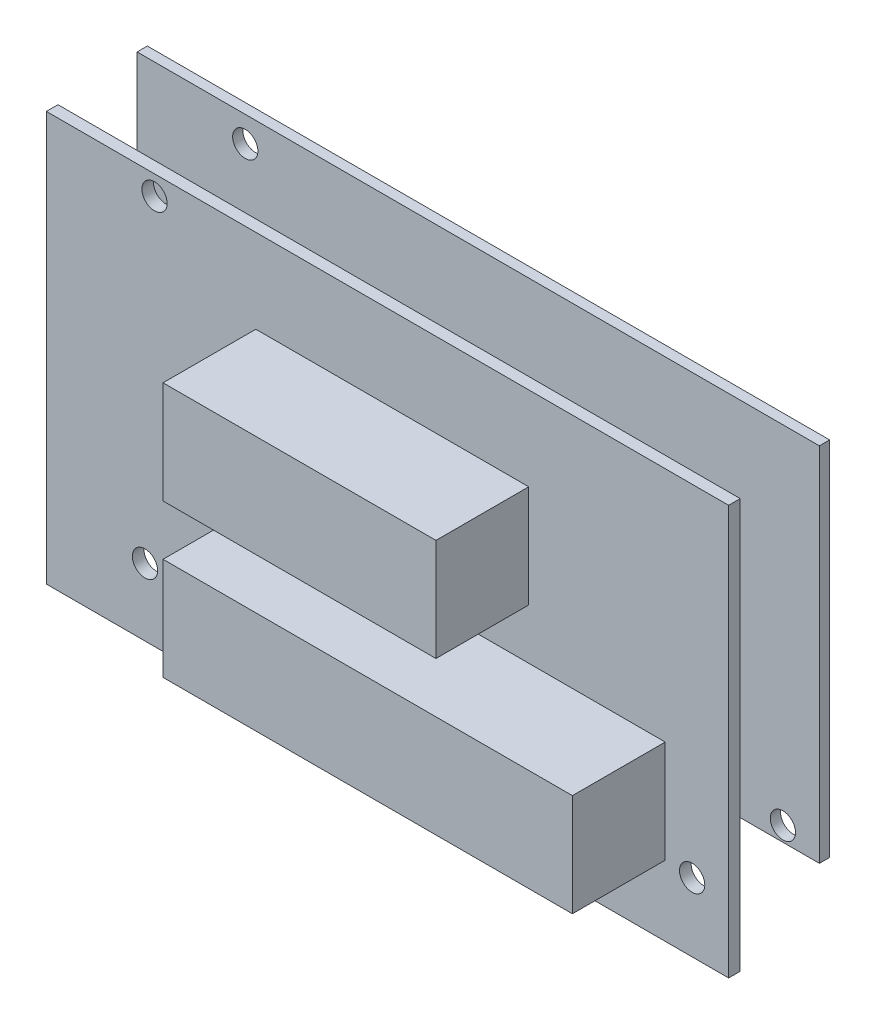
ISO-10303-21;
HEADER;
FILE_DESCRIPTION(('STEP AP214'),'2;1');
FILE_NAME('part.step','',(''),(''),'','','');
FILE_SCHEMA(('AUTOMOTIVE_DESIGN { 1 0 10303 214 1 1 1 1 }'));
ENDSEC;
DATA;
#1=APPLICATION_CONTEXT('core data for automotive mechanical design processes');
#2=APPLICATION_PROTOCOL_DEFINITION('international standard','automotive_design',2000,#1);
#3=PRODUCT_CONTEXT('',#1,'mechanical');
#4=PRODUCT('Part','Part','',(#3));
#5=PRODUCT_RELATED_PRODUCT_CATEGORY('part','',(#4));
#6=PRODUCT_DEFINITION_FORMATION('','',#4);
#7=PRODUCT_DEFINITION_CONTEXT('part definition',#1,'design');
#8=PRODUCT_DEFINITION('design','',#6,#7);
#9=PRODUCT_DEFINITION_SHAPE('','',#8);
#10=(LENGTH_UNIT() NAMED_UNIT(*) SI_UNIT(.MILLI.,.METRE.));
#11=(NAMED_UNIT(*) PLANE_ANGLE_UNIT() SI_UNIT($,.RADIAN.));
#12=(NAMED_UNIT(*) SI_UNIT($,.STERADIAN.) SOLID_ANGLE_UNIT());
#13=UNCERTAINTY_MEASURE_WITH_UNIT(LENGTH_MEASURE(1.E-05),#10,'distance_accuracy_value','');
#14=(GEOMETRIC_REPRESENTATION_CONTEXT(3) GLOBAL_UNCERTAINTY_ASSIGNED_CONTEXT((#13)) GLOBAL_UNIT_ASSIGNED_CONTEXT((#10,
#11,#12)) REPRESENTATION_CONTEXT('',''));
#15=CARTESIAN_POINT('',(0.,0.,0.));
#16=DIRECTION('',(0.,0.,1.));
#17=DIRECTION('',(1.,0.,0.));
#18=AXIS2_PLACEMENT_3D('',#15,#16,#17);
#19=CARTESIAN_POINT('',(0.,0.,-13.1));
#20=DIRECTION('',(0.,0.,1.));
#21=DIRECTION('',(1.,0.,0.));
#22=AXIS2_PLACEMENT_3D('',#19,#20,#21);
#23=PLANE('',#22);
#24=DIRECTION('',(0.,1.,0.));
#25=VECTOR('',#24,1.);
#26=CARTESIAN_POINT('',(-50.,30.9,-13.1));
#27=LINE('',#26,#25);
#28=CARTESIAN_POINT('',(-50.,-22.1,-13.1));
#29=VERTEX_POINT('',#28);
#30=CARTESIAN_POINT('',(-50.,30.9,-13.1));
#31=VERTEX_POINT('',#30);
#32=EDGE_CURVE('E95',#29,#31,#27,.T.);
#33=ORIENTED_EDGE('',*,*,#32,.T.);
#34=DIRECTION('',(1.,0.,0.));
#35=VECTOR('',#34,1.);
#36=CARTESIAN_POINT('',(-50.,30.9,-13.1));
#37=LINE('',#36,#35);
#38=CARTESIAN_POINT('',(50.,30.9,-13.1));
#39=VERTEX_POINT('',#38);
#40=EDGE_CURVE('E90',#31,#39,#37,.T.);
#41=ORIENTED_EDGE('',*,*,#40,.T.);
#42=DIRECTION('',(0.,-1.,0.));
#43=VECTOR('',#42,1.);
#44=CARTESIAN_POINT('',(50.,30.9,-13.1));
#45=LINE('',#44,#43);
#46=CARTESIAN_POINT('',(50.,-22.1,-13.1));
#47=VERTEX_POINT('',#46);
#48=EDGE_CURVE('E93',#39,#47,#45,.T.);
#49=ORIENTED_EDGE('',*,*,#48,.T.);
#50=DIRECTION('',(-1.,0.,0.));
#51=VECTOR('',#50,1.);
#52=CARTESIAN_POINT('',(-50.,-22.1,-13.1));
#53=LINE('',#52,#51);
#54=EDGE_CURVE('E60',#47,#29,#53,.T.);
#55=ORIENTED_EDGE('',*,*,#54,.T.);
#56=EDGE_LOOP('',(#33,#41,#49,#55));
#57=FACE_BOUND('',#56,.T.);
#58=CARTESIAN_POINT('',(44.65,-19.95,-13.1));
#59=DIRECTION('',(0.,0.,-1.));
#60=DIRECTION('',(-1.,0.,0.));
#61=AXIS2_PLACEMENT_3D('',#58,#59,#60);
#62=CIRCLE('',#61,1.85);
#63=CARTESIAN_POINT('',(42.8,-19.95,-13.1));
#64=VERTEX_POINT('',#63);
#65=EDGE_CURVE('E110',#64,#64,#62,.T.);
#66=ORIENTED_EDGE('',*,*,#65,.F.);
#67=EDGE_LOOP('',(#66));
#68=FACE_BOUND('',#67,.T.);
#69=CARTESIAN_POINT('',(-34.15,27.15,-13.1));
#70=DIRECTION('',(0.,0.,-1.));
#71=DIRECTION('',(-1.,0.,0.));
#72=AXIS2_PLACEMENT_3D('',#69,#70,#71);
#73=CIRCLE('',#72,1.85);
#74=CARTESIAN_POINT('',(-36.,27.15,-13.1));
#75=VERTEX_POINT('',#74);
#76=EDGE_CURVE('E125',#75,#75,#73,.T.);
#77=ORIENTED_EDGE('',*,*,#76,.F.);
#78=EDGE_LOOP('',(#77));
#79=FACE_BOUND('',#78,.T.);
#80=CARTESIAN_POINT('',(-35.55,-20.15,-13.1));
#81=DIRECTION('',(0.,0.,-1.));
#82=DIRECTION('',(-1.,0.,0.));
#83=AXIS2_PLACEMENT_3D('',#80,#81,#82);
#84=CIRCLE('',#83,1.85);
#85=CARTESIAN_POINT('',(-37.4,-20.15,-13.1));
#86=VERTEX_POINT('',#85);
#87=EDGE_CURVE('E131',#86,#86,#84,.T.);
#88=ORIENTED_EDGE('',*,*,#87,.F.);
#89=EDGE_LOOP('',(#88));
#90=FACE_BOUND('',#89,.T.);
#91=ADVANCED_FACE('F43',(#57,#68,#79,#90),#23,.F.);
#92=CARTESIAN_POINT('',(0.,0.,-11.6));
#93=DIRECTION('',(0.,0.,1.));
#94=DIRECTION('',(1.,0.,0.));
#95=AXIS2_PLACEMENT_3D('',#92,#93,#94);
#96=PLANE('',#95);
#97=CARTESIAN_POINT('',(-34.15,27.15,-11.6));
#98=DIRECTION('',(0.,0.,-1.));
#99=DIRECTION('',(-1.,0.,0.));
#100=AXIS2_PLACEMENT_3D('',#97,#98,#99);
#101=CIRCLE('',#100,1.85);
#102=CARTESIAN_POINT('',(-36.,27.15,-11.6));
#103=VERTEX_POINT('',#102);
#104=EDGE_CURVE('E128',#103,#103,#101,.T.);
#105=ORIENTED_EDGE('',*,*,#104,.T.);
#106=EDGE_LOOP('',(#105));
#107=FACE_BOUND('',#106,.T.);
#108=DIRECTION('',(0.,1.,0.));
#109=VECTOR('',#108,1.);
#110=CARTESIAN_POINT('',(-50.,30.9,-11.6));
#111=LINE('',#110,#109);
#112=CARTESIAN_POINT('',(-50.,-22.1,-11.6));
#113=VERTEX_POINT('',#112);
#114=CARTESIAN_POINT('',(-50.,30.9,-11.6));
#115=VERTEX_POINT('',#114);
#116=EDGE_CURVE('E107',#113,#115,#111,.T.);
#117=ORIENTED_EDGE('',*,*,#116,.F.);
#118=DIRECTION('',(-1.,0.,0.));
#119=VECTOR('',#118,1.);
#120=CARTESIAN_POINT('',(-50.,-22.1,-11.6));
#121=LINE('',#120,#119);
#122=CARTESIAN_POINT('',(50.,-22.1,-11.6));
#123=VERTEX_POINT('',#122);
#124=EDGE_CURVE('E83',#123,#113,#121,.T.);
#125=ORIENTED_EDGE('',*,*,#124,.F.);
#126=DIRECTION('',(0.,-1.,0.));
#127=VECTOR('',#126,1.);
#128=CARTESIAN_POINT('',(50.,30.9,-11.6));
#129=LINE('',#128,#127);
#130=CARTESIAN_POINT('',(50.,30.9,-11.6));
#131=VERTEX_POINT('',#130);
#132=EDGE_CURVE('E77',#131,#123,#129,.T.);
#133=ORIENTED_EDGE('',*,*,#132,.F.);
#134=DIRECTION('',(1.,0.,0.));
#135=VECTOR('',#134,1.);
#136=CARTESIAN_POINT('',(-50.,30.9,-11.6));
#137=LINE('',#136,#135);
#138=EDGE_CURVE('E99',#115,#131,#137,.T.);
#139=ORIENTED_EDGE('',*,*,#138,.F.);
#140=EDGE_LOOP('',(#117,#125,#133,#139));
#141=FACE_BOUND('',#140,.T.);
#142=CARTESIAN_POINT('',(44.65,-19.95,-11.6));
#143=DIRECTION('',(0.,0.,-1.));
#144=DIRECTION('',(-1.,0.,0.));
#145=AXIS2_PLACEMENT_3D('',#142,#143,#144);
#146=CIRCLE('',#145,1.85);
#147=CARTESIAN_POINT('',(42.8,-19.95,-11.6));
#148=VERTEX_POINT('',#147);
#149=EDGE_CURVE('E122',#148,#148,#146,.T.);
#150=ORIENTED_EDGE('',*,*,#149,.T.);
#151=EDGE_LOOP('',(#150));
#152=FACE_BOUND('',#151,.T.);
#153=CARTESIAN_POINT('',(-35.55,-20.15,-11.6));
#154=DIRECTION('',(0.,0.,-1.));
#155=DIRECTION('',(-1.,0.,0.));
#156=AXIS2_PLACEMENT_3D('',#153,#154,#155);
#157=CIRCLE('',#156,1.85);
#158=CARTESIAN_POINT('',(-37.4,-20.15,-11.6));
#159=VERTEX_POINT('',#158);
#160=EDGE_CURVE('E134',#159,#159,#157,.T.);
#161=ORIENTED_EDGE('',*,*,#160,.T.);
#162=EDGE_LOOP('',(#161));
#163=FACE_BOUND('',#162,.T.);
#164=ADVANCED_FACE('F118',(#107,#141,#152,#163),#96,.T.);
#165=CARTESIAN_POINT('',(-50.,30.9,-13.1));
#166=DIRECTION('',(1.,0.,0.));
#167=DIRECTION('',(0.,1.,0.));
#168=AXIS2_PLACEMENT_3D('',#165,#166,#167);
#169=PLANE('',#168);
#170=ORIENTED_EDGE('',*,*,#116,.T.);
#171=DIRECTION('',(0.,0.,1.));
#172=VECTOR('',#171,1.);
#173=CARTESIAN_POINT('',(-50.,30.9,-13.1));
#174=LINE('',#173,#172);
#175=EDGE_CURVE('E12',#31,#115,#174,.T.);
#176=ORIENTED_EDGE('',*,*,#175,.F.);
#177=ORIENTED_EDGE('',*,*,#32,.F.);
#178=DIRECTION('',(0.,0.,1.));
#179=VECTOR('',#178,1.);
#180=CARTESIAN_POINT('',(-50.,-22.1,-13.1));
#181=LINE('',#180,#179);
#182=EDGE_CURVE('E103',#29,#113,#181,.T.);
#183=ORIENTED_EDGE('',*,*,#182,.T.);
#184=EDGE_LOOP('',(#170,#176,#177,#183));
#185=FACE_BOUND('',#184,.T.);
#186=ADVANCED_FACE('F45',(#185),#169,.F.);
#187=CARTESIAN_POINT('',(-50.,30.9,-13.1));
#188=DIRECTION('',(0.,-1.,0.));
#189=DIRECTION('',(1.,0.,0.));
#190=AXIS2_PLACEMENT_3D('',#187,#188,#189);
#191=PLANE('',#190);
#192=ORIENTED_EDGE('',*,*,#138,.T.);
#193=DIRECTION('',(0.,0.,1.));
#194=VECTOR('',#193,1.);
#195=CARTESIAN_POINT('',(50.,30.9,-13.1));
#196=LINE('',#195,#194);
#197=EDGE_CURVE('E52',#39,#131,#196,.T.);
#198=ORIENTED_EDGE('',*,*,#197,.F.);
#199=ORIENTED_EDGE('',*,*,#40,.F.);
#200=ORIENTED_EDGE('',*,*,#175,.T.);
#201=EDGE_LOOP('',(#192,#198,#199,#200));
#202=FACE_BOUND('',#201,.T.);
#203=ADVANCED_FACE('F98',(#202),#191,.F.);
#204=CARTESIAN_POINT('',(50.,30.9,-13.1));
#205=DIRECTION('',(-1.,0.,0.));
#206=DIRECTION('',(0.,-1.,0.));
#207=AXIS2_PLACEMENT_3D('',#204,#205,#206);
#208=PLANE('',#207);
#209=ORIENTED_EDGE('',*,*,#132,.T.);
#210=DIRECTION('',(0.,0.,1.));
#211=VECTOR('',#210,1.);
#212=CARTESIAN_POINT('',(50.,-22.1,-13.1));
#213=LINE('',#212,#211);
#214=EDGE_CURVE('E100',#47,#123,#213,.T.);
#215=ORIENTED_EDGE('',*,*,#214,.F.);
#216=ORIENTED_EDGE('',*,*,#48,.F.);
#217=ORIENTED_EDGE('',*,*,#197,.T.);
#218=EDGE_LOOP('',(#209,#215,#216,#217));
#219=FACE_BOUND('',#218,.T.);
#220=ADVANCED_FACE('F101',(#219),#208,.F.);
#221=CARTESIAN_POINT('',(-50.,-22.1,-13.1));
#222=DIRECTION('',(0.,1.,0.));
#223=DIRECTION('',(-1.,0.,0.));
#224=AXIS2_PLACEMENT_3D('',#221,#222,#223);
#225=PLANE('',#224);
#226=ORIENTED_EDGE('',*,*,#124,.T.);
#227=ORIENTED_EDGE('',*,*,#182,.F.);
#228=ORIENTED_EDGE('',*,*,#54,.F.);
#229=ORIENTED_EDGE('',*,*,#214,.T.);
#230=EDGE_LOOP('',(#226,#227,#228,#229));
#231=FACE_BOUND('',#230,.T.);
#232=ADVANCED_FACE('F115',(#231),#225,.F.);
#233=CARTESIAN_POINT('',(44.65,-19.95,-13.1));
#234=DIRECTION('',(0.,0.,1.));
#235=DIRECTION('',(1.,0.,0.));
#236=AXIS2_PLACEMENT_3D('',#233,#234,#235);
#237=CYLINDRICAL_SURFACE('',#236,1.85);
#238=ORIENTED_EDGE('',*,*,#65,.T.);
#239=EDGE_LOOP('',(#238));
#240=FACE_BOUND('',#239,.T.);
#241=ORIENTED_EDGE('',*,*,#149,.F.);
#242=EDGE_LOOP('',(#241));
#243=FACE_BOUND('',#242,.T.);
#244=ADVANCED_FACE('F151',(#240,#243),#237,.F.);
#245=CARTESIAN_POINT('',(-34.15,27.15,-13.1));
#246=DIRECTION('',(0.,0.,1.));
#247=DIRECTION('',(1.,0.,0.));
#248=AXIS2_PLACEMENT_3D('',#245,#246,#247);
#249=CYLINDRICAL_SURFACE('',#248,1.85);
#250=ORIENTED_EDGE('',*,*,#76,.T.);
#251=EDGE_LOOP('',(#250));
#252=FACE_BOUND('',#251,.T.);
#253=ORIENTED_EDGE('',*,*,#104,.F.);
#254=EDGE_LOOP('',(#253));
#255=FACE_BOUND('',#254,.T.);
#256=ADVANCED_FACE('F197',(#252,#255),#249,.F.);
#257=CARTESIAN_POINT('',(-35.55,-20.15,-13.1));
#258=DIRECTION('',(0.,0.,1.));
#259=DIRECTION('',(1.,0.,0.));
#260=AXIS2_PLACEMENT_3D('',#257,#258,#259);
#261=CYLINDRICAL_SURFACE('',#260,1.85);
#262=ORIENTED_EDGE('',*,*,#87,.T.);
#263=EDGE_LOOP('',(#262));
#264=FACE_BOUND('',#263,.T.);
#265=ORIENTED_EDGE('',*,*,#160,.F.);
#266=EDGE_LOOP('',(#265));
#267=FACE_BOUND('',#266,.T.);
#268=ADVANCED_FACE('F140',(#264,#267),#261,.F.);
#269=CLOSED_SHELL('',(#91,#164,#186,#203,#220,#232,#244,#256,#268));
#270=MANIFOLD_SOLID_BREP('B2',#269);
#271=CARTESIAN_POINT('',(0.,0.,1.7));
#272=DIRECTION('',(0.,0.,1.));
#273=DIRECTION('',(1.,0.,0.));
#274=AXIS2_PLACEMENT_3D('',#271,#272,#273);
#275=PLANE('',#274);
#276=CARTESIAN_POINT('',(-35.55,-20.15,1.7));
#277=DIRECTION('',(0.,0.,1.));
#278=DIRECTION('',(1.,0.,0.));
#279=AXIS2_PLACEMENT_3D('',#276,#277,#278);
#280=CIRCLE('',#279,1.85);
#281=CARTESIAN_POINT('',(-33.7,-20.15,1.7));
#282=VERTEX_POINT('',#281);
#283=EDGE_CURVE('E383',#282,#282,#280,.T.);
#284=ORIENTED_EDGE('',*,*,#283,.F.);
#285=EDGE_LOOP('',(#284));
#286=FACE_BOUND('',#285,.T.);
#287=DIRECTION('',(0.,1.,0.));
#288=VECTOR('',#287,1.);
#289=CARTESIAN_POINT('',(50.,30.,1.7));
#290=LINE('',#289,#288);
#291=CARTESIAN_POINT('',(50.,-30.,1.7));
#292=VERTEX_POINT('',#291);
#293=CARTESIAN_POINT('',(50.,30.,1.7));
#294=VERTEX_POINT('',#293);
#295=EDGE_CURVE('E395',#292,#294,#290,.T.);
#296=ORIENTED_EDGE('',*,*,#295,.T.);
#297=DIRECTION('',(-1.,0.,0.));
#298=VECTOR('',#297,1.);
#299=CARTESIAN_POINT('',(-50.,30.,1.7));
#300=LINE('',#299,#298);
#301=CARTESIAN_POINT('',(-50.,30.,1.7));
#302=VERTEX_POINT('',#301);
#303=EDGE_CURVE('E398',#294,#302,#300,.T.);
#304=ORIENTED_EDGE('',*,*,#303,.T.);
#305=DIRECTION('',(0.,-1.,0.));
#306=VECTOR('',#305,1.);
#307=CARTESIAN_POINT('',(-50.,30.,1.7));
#308=LINE('',#307,#306);
#309=CARTESIAN_POINT('',(-50.,-30.,1.7));
#310=VERTEX_POINT('',#309);
#311=EDGE_CURVE('E401',#302,#310,#308,.T.);
#312=ORIENTED_EDGE('',*,*,#311,.T.);
#313=DIRECTION('',(1.,0.,0.));
#314=VECTOR('',#313,1.);
#315=CARTESIAN_POINT('',(-50.,-30.,1.7));
#316=LINE('',#315,#314);
#317=EDGE_CURVE('E403',#310,#292,#316,.T.);
#318=ORIENTED_EDGE('',*,*,#317,.T.);
#319=EDGE_LOOP('',(#296,#304,#312,#318));
#320=FACE_BOUND('',#319,.T.);
#321=CARTESIAN_POINT('',(-34.15,27.15,1.7));
#322=DIRECTION('',(0.,0.,1.));
#323=DIRECTION('',(1.,0.,0.));
#324=AXIS2_PLACEMENT_3D('',#321,#322,#323);
#325=CIRCLE('',#324,1.85);
#326=CARTESIAN_POINT('',(-32.3,27.15,1.7));
#327=VERTEX_POINT('',#326);
#328=EDGE_CURVE('E389',#327,#327,#325,.T.);
#329=ORIENTED_EDGE('',*,*,#328,.F.);
#330=EDGE_LOOP('',(#329));
#331=FACE_BOUND('',#330,.T.);
#332=CARTESIAN_POINT('',(44.65,-19.95,1.7));
#333=DIRECTION('',(0.,0.,1.));
#334=DIRECTION('',(1.,0.,0.));
#335=AXIS2_PLACEMENT_3D('',#332,#333,#334);
#336=CIRCLE('',#335,1.85);
#337=CARTESIAN_POINT('',(46.5,-19.95,1.7));
#338=VERTEX_POINT('',#337);
#339=EDGE_CURVE('E377',#338,#338,#336,.T.);
#340=ORIENTED_EDGE('',*,*,#339,.F.);
#341=EDGE_LOOP('',(#340));
#342=FACE_BOUND('',#341,.T.);
#343=DIRECTION('',(1.,0.,0.));
#344=VECTOR('',#343,1.);
#345=CARTESIAN_POINT('',(-19.3,-19.7,1.7));
#346=LINE('',#345,#344);
#347=CARTESIAN_POINT('',(-19.3,-19.7,1.7));
#348=VERTEX_POINT('',#347);
#349=CARTESIAN_POINT('',(40.7,-19.7,1.7));
#350=VERTEX_POINT('',#349);
#351=EDGE_CURVE('E348',#348,#350,#346,.T.);
#352=ORIENTED_EDGE('',*,*,#351,.F.);
#353=DIRECTION('',(0.,-1.,0.));
#354=VECTOR('',#353,1.);
#355=CARTESIAN_POINT('',(-19.3,-4.7,1.7));
#356=LINE('',#355,#354);
#357=CARTESIAN_POINT('',(-19.3,-4.7,1.7));
#358=VERTEX_POINT('',#357);
#359=EDGE_CURVE('E345',#358,#348,#356,.T.);
#360=ORIENTED_EDGE('',*,*,#359,.F.);
#361=DIRECTION('',(-1.,0.,0.));
#362=VECTOR('',#361,1.);
#363=CARTESIAN_POINT('',(-19.3,-4.7,1.7));
#364=LINE('',#363,#362);
#365=CARTESIAN_POINT('',(40.7,-4.7,1.7));
#366=VERTEX_POINT('',#365);
#367=EDGE_CURVE('E357',#366,#358,#364,.T.);
#368=ORIENTED_EDGE('',*,*,#367,.F.);
#369=DIRECTION('',(0.,1.,0.));
#370=VECTOR('',#369,1.);
#371=CARTESIAN_POINT('',(40.7,-4.7,1.7));
#372=LINE('',#371,#370);
#373=EDGE_CURVE('E365',#350,#366,#372,.T.);
#374=ORIENTED_EDGE('',*,*,#373,.F.);
#375=EDGE_LOOP('',(#352,#360,#368,#374));
#376=FACE_BOUND('',#375,.T.);
#377=DIRECTION('',(1.,0.,0.));
#378=VECTOR('',#377,1.);
#379=CARTESIAN_POINT('',(-19.3,2.7,1.7));
#380=LINE('',#379,#378);
#381=CARTESIAN_POINT('',(-19.3,2.7,1.7));
#382=VERTEX_POINT('',#381);
#383=CARTESIAN_POINT('',(20.7,2.7,1.7));
#384=VERTEX_POINT('',#383);
#385=EDGE_CURVE('E625',#382,#384,#380,.T.);
#386=ORIENTED_EDGE('',*,*,#385,.F.);
#387=DIRECTION('',(0.,-1.,0.));
#388=VECTOR('',#387,1.);
#389=CARTESIAN_POINT('',(-19.3,2.7,1.7));
#390=LINE('',#389,#388);
#391=CARTESIAN_POINT('',(-19.3,17.7,1.7));
#392=VERTEX_POINT('',#391);
#393=EDGE_CURVE('E343',#392,#382,#390,.T.);
#394=ORIENTED_EDGE('',*,*,#393,.F.);
#395=DIRECTION('',(-1.,0.,0.));
#396=VECTOR('',#395,1.);
#397=CARTESIAN_POINT('',(-19.3,17.7,1.7));
#398=LINE('',#397,#396);
#399=CARTESIAN_POINT('',(20.7,17.7,1.7));
#400=VERTEX_POINT('',#399);
#401=EDGE_CURVE('E339',#400,#392,#398,.T.);
#402=ORIENTED_EDGE('',*,*,#401,.F.);
#403=DIRECTION('',(0.,1.,0.));
#404=VECTOR('',#403,1.);
#405=CARTESIAN_POINT('',(20.7,2.7,1.7));
#406=LINE('',#405,#404);
#407=EDGE_CURVE('E622',#384,#400,#406,.T.);
#408=ORIENTED_EDGE('',*,*,#407,.F.);
#409=EDGE_LOOP('',(#386,#394,#402,#408));
#410=FACE_BOUND('',#409,.T.);
#411=ADVANCED_FACE('F230',(#286,#320,#331,#342,#376,#410),#275,.T.);
#412=CARTESIAN_POINT('',(0.,0.,0.));
#413=DIRECTION('',(0.,0.,1.));
#414=DIRECTION('',(1.,0.,0.));
#415=AXIS2_PLACEMENT_3D('',#412,#413,#414);
#416=PLANE('',#415);
#417=DIRECTION('',(0.,1.,0.));
#418=VECTOR('',#417,1.);
#419=CARTESIAN_POINT('',(50.,30.,0.));
#420=LINE('',#419,#418);
#421=CARTESIAN_POINT('',(50.,-30.,0.));
#422=VERTEX_POINT('',#421);
#423=CARTESIAN_POINT('',(50.,30.,0.));
#424=VERTEX_POINT('',#423);
#425=EDGE_CURVE('E392',#422,#424,#420,.T.);
#426=ORIENTED_EDGE('',*,*,#425,.F.);
#427=DIRECTION('',(1.,0.,0.));
#428=VECTOR('',#427,1.);
#429=CARTESIAN_POINT('',(-50.,-30.,0.));
#430=LINE('',#429,#428);
#431=CARTESIAN_POINT('',(-50.,-30.,0.));
#432=VERTEX_POINT('',#431);
#433=EDGE_CURVE('E399',#432,#422,#430,.T.);
#434=ORIENTED_EDGE('',*,*,#433,.F.);
#435=DIRECTION('',(0.,-1.,0.));
#436=VECTOR('',#435,1.);
#437=CARTESIAN_POINT('',(-50.,30.,0.));
#438=LINE('',#437,#436);
#439=CARTESIAN_POINT('',(-50.,30.,0.));
#440=VERTEX_POINT('',#439);
#441=EDGE_CURVE('E410',#440,#432,#438,.T.);
#442=ORIENTED_EDGE('',*,*,#441,.F.);
#443=DIRECTION('',(-1.,0.,0.));
#444=VECTOR('',#443,1.);
#445=CARTESIAN_POINT('',(-50.,30.,0.));
#446=LINE('',#445,#444);
#447=EDGE_CURVE('E408',#424,#440,#446,.T.);
#448=ORIENTED_EDGE('',*,*,#447,.F.);
#449=EDGE_LOOP('',(#426,#434,#442,#448));
#450=FACE_BOUND('',#449,.T.);
#451=CARTESIAN_POINT('',(-34.15,27.15,0.));
#452=DIRECTION('',(0.,0.,1.));
#453=DIRECTION('',(1.,0.,0.));
#454=AXIS2_PLACEMENT_3D('',#451,#452,#453);
#455=CIRCLE('',#454,1.85);
#456=CARTESIAN_POINT('',(-32.3,27.15,0.));
#457=VERTEX_POINT('',#456);
#458=EDGE_CURVE('E386',#457,#457,#455,.T.);
#459=ORIENTED_EDGE('',*,*,#458,.T.);
#460=EDGE_LOOP('',(#459));
#461=FACE_BOUND('',#460,.T.);
#462=CARTESIAN_POINT('',(-35.55,-20.15,0.));
#463=DIRECTION('',(0.,0.,1.));
#464=DIRECTION('',(1.,0.,0.));
#465=AXIS2_PLACEMENT_3D('',#462,#463,#464);
#466=CIRCLE('',#465,1.85);
#467=CARTESIAN_POINT('',(-33.7,-20.15,0.));
#468=VERTEX_POINT('',#467);
#469=EDGE_CURVE('E380',#468,#468,#466,.T.);
#470=ORIENTED_EDGE('',*,*,#469,.T.);
#471=EDGE_LOOP('',(#470));
#472=FACE_BOUND('',#471,.T.);
#473=CARTESIAN_POINT('',(44.65,-19.95,0.));
#474=DIRECTION('',(0.,0.,1.));
#475=DIRECTION('',(1.,0.,0.));
#476=AXIS2_PLACEMENT_3D('',#473,#474,#475);
#477=CIRCLE('',#476,1.85);
#478=CARTESIAN_POINT('',(46.5,-19.95,0.));
#479=VERTEX_POINT('',#478);
#480=EDGE_CURVE('E376',#479,#479,#477,.T.);
#481=ORIENTED_EDGE('',*,*,#480,.T.);
#482=EDGE_LOOP('',(#481));
#483=FACE_BOUND('',#482,.T.);
#484=ADVANCED_FACE('F428',(#450,#461,#472,#483),#416,.F.);
#485=CARTESIAN_POINT('',(50.,30.,1.7));
#486=DIRECTION('',(-1.,0.,0.));
#487=DIRECTION('',(0.,-1.,0.));
#488=AXIS2_PLACEMENT_3D('',#485,#486,#487);
#489=PLANE('',#488);
#490=ORIENTED_EDGE('',*,*,#425,.T.);
#491=DIRECTION('',(0.,0.,-1.));
#492=VECTOR('',#491,1.);
#493=CARTESIAN_POINT('',(50.,30.,1.7));
#494=LINE('',#493,#492);
#495=EDGE_CURVE('E41',#294,#424,#494,.T.);
#496=ORIENTED_EDGE('',*,*,#495,.F.);
#497=ORIENTED_EDGE('',*,*,#295,.F.);
#498=DIRECTION('',(0.,0.,-1.));
#499=VECTOR('',#498,1.);
#500=CARTESIAN_POINT('',(50.,-30.,1.7));
#501=LINE('',#500,#499);
#502=EDGE_CURVE('E405',#292,#422,#501,.T.);
#503=ORIENTED_EDGE('',*,*,#502,.T.);
#504=EDGE_LOOP('',(#490,#496,#497,#503));
#505=FACE_BOUND('',#504,.T.);
#506=ADVANCED_FACE('F232',(#505),#489,.F.);
#507=CARTESIAN_POINT('',(-50.,30.,1.7));
#508=DIRECTION('',(0.,-1.,0.));
#509=DIRECTION('',(0.,0.,-1.));
#510=AXIS2_PLACEMENT_3D('',#507,#508,#509);
#511=PLANE('',#510);
#512=ORIENTED_EDGE('',*,*,#447,.T.);
#513=DIRECTION('',(0.,0.,-1.));
#514=VECTOR('',#513,1.);
#515=CARTESIAN_POINT('',(-50.,30.,1.7));
#516=LINE('',#515,#514);
#517=EDGE_CURVE('E238',#302,#440,#516,.T.);
#518=ORIENTED_EDGE('',*,*,#517,.F.);
#519=ORIENTED_EDGE('',*,*,#303,.F.);
#520=ORIENTED_EDGE('',*,*,#495,.T.);
#521=EDGE_LOOP('',(#512,#518,#519,#520));
#522=FACE_BOUND('',#521,.T.);
#523=ADVANCED_FACE('F439',(#522),#511,.F.);
#524=CARTESIAN_POINT('',(-50.,30.,1.7));
#525=DIRECTION('',(1.,0.,0.));
#526=DIRECTION('',(0.,0.,-1.));
#527=AXIS2_PLACEMENT_3D('',#524,#525,#526);
#528=PLANE('',#527);
#529=ORIENTED_EDGE('',*,*,#441,.T.);
#530=DIRECTION('',(0.,0.,-1.));
#531=VECTOR('',#530,1.);
#532=CARTESIAN_POINT('',(-50.,-30.,1.7));
#533=LINE('',#532,#531);
#534=EDGE_CURVE('E415',#310,#432,#533,.T.);
#535=ORIENTED_EDGE('',*,*,#534,.F.);
#536=ORIENTED_EDGE('',*,*,#311,.F.);
#537=ORIENTED_EDGE('',*,*,#517,.T.);
#538=EDGE_LOOP('',(#529,#535,#536,#537));
#539=FACE_BOUND('',#538,.T.);
#540=ADVANCED_FACE('F422',(#539),#528,.F.);
#541=CARTESIAN_POINT('',(-50.,-30.,1.7));
#542=DIRECTION('',(0.,1.,0.));
#543=DIRECTION('',(0.,0.,1.));
#544=AXIS2_PLACEMENT_3D('',#541,#542,#543);
#545=PLANE('',#544);
#546=ORIENTED_EDGE('',*,*,#433,.T.);
#547=ORIENTED_EDGE('',*,*,#502,.F.);
#548=ORIENTED_EDGE('',*,*,#317,.F.);
#549=ORIENTED_EDGE('',*,*,#534,.T.);
#550=EDGE_LOOP('',(#546,#547,#548,#549));
#551=FACE_BOUND('',#550,.T.);
#552=ADVANCED_FACE('F432',(#551),#545,.F.);
#553=CARTESIAN_POINT('',(-34.15,27.15,1.7));
#554=DIRECTION('',(0.,0.,-1.));
#555=DIRECTION('',(-1.,0.,0.));
#556=AXIS2_PLACEMENT_3D('',#553,#554,#555);
#557=CYLINDRICAL_SURFACE('',#556,1.85);
#558=ORIENTED_EDGE('',*,*,#328,.T.);
#559=EDGE_LOOP('',(#558));
#560=FACE_BOUND('',#559,.T.);
#561=ORIENTED_EDGE('',*,*,#458,.F.);
#562=EDGE_LOOP('',(#561));
#563=FACE_BOUND('',#562,.T.);
#564=ADVANCED_FACE('F455',(#560,#563),#557,.F.);
#565=CARTESIAN_POINT('',(-35.55,-20.15,1.7));
#566=DIRECTION('',(0.,0.,-1.));
#567=DIRECTION('',(-1.,0.,0.));
#568=AXIS2_PLACEMENT_3D('',#565,#566,#567);
#569=CYLINDRICAL_SURFACE('',#568,1.85);
#570=ORIENTED_EDGE('',*,*,#283,.T.);
#571=EDGE_LOOP('',(#570));
#572=FACE_BOUND('',#571,.T.);
#573=ORIENTED_EDGE('',*,*,#469,.F.);
#574=EDGE_LOOP('',(#573));
#575=FACE_BOUND('',#574,.T.);
#576=ADVANCED_FACE('F462',(#572,#575),#569,.F.);
#577=CARTESIAN_POINT('',(44.65,-19.95,1.7));
#578=DIRECTION('',(0.,0.,-1.));
#579=DIRECTION('',(-1.,0.,0.));
#580=AXIS2_PLACEMENT_3D('',#577,#578,#579);
#581=CYLINDRICAL_SURFACE('',#580,1.85);
#582=ORIENTED_EDGE('',*,*,#339,.T.);
#583=EDGE_LOOP('',(#582));
#584=FACE_BOUND('',#583,.T.);
#585=ORIENTED_EDGE('',*,*,#480,.F.);
#586=EDGE_LOOP('',(#585));
#587=FACE_BOUND('',#586,.T.);
#588=ADVANCED_FACE('F467',(#584,#587),#581,.F.);
#589=CARTESIAN_POINT('',(-19.3,-4.7,15.3));
#590=DIRECTION('',(1.,0.,0.));
#591=DIRECTION('',(0.,1.,0.));
#592=AXIS2_PLACEMENT_3D('',#589,#590,#591);
#593=PLANE('',#592);
#594=ORIENTED_EDGE('',*,*,#359,.T.);
#595=DIRECTION('',(0.,0.,-1.));
#596=VECTOR('',#595,1.);
#597=CARTESIAN_POINT('',(-19.3,-19.7,15.3));
#598=LINE('',#597,#596);
#599=CARTESIAN_POINT('',(-19.3,-19.7,15.3));
#600=VERTEX_POINT('',#599);
#601=EDGE_CURVE('E374',#600,#348,#598,.T.);
#602=ORIENTED_EDGE('',*,*,#601,.F.);
#603=DIRECTION('',(0.,-1.,0.));
#604=VECTOR('',#603,1.);
#605=CARTESIAN_POINT('',(-19.3,-4.7,15.3));
#606=LINE('',#605,#604);
#607=CARTESIAN_POINT('',(-19.3,-4.7,15.3));
#608=VERTEX_POINT('',#607);
#609=EDGE_CURVE('E353',#608,#600,#606,.T.);
#610=ORIENTED_EDGE('',*,*,#609,.F.);
#611=DIRECTION('',(0.,0.,-1.));
#612=VECTOR('',#611,1.);
#613=CARTESIAN_POINT('',(-19.3,-4.7,15.3));
#614=LINE('',#613,#612);
#615=EDGE_CURVE('E362',#608,#358,#614,.T.);
#616=ORIENTED_EDGE('',*,*,#615,.T.);
#617=EDGE_LOOP('',(#594,#602,#610,#616));
#618=FACE_BOUND('',#617,.T.);
#619=ADVANCED_FACE('F478',(#618),#593,.F.);
#620=CARTESIAN_POINT('',(-19.3,-19.7,15.3));
#621=DIRECTION('',(0.,1.,0.));
#622=DIRECTION('',(0.,0.,1.));
#623=AXIS2_PLACEMENT_3D('',#620,#621,#622);
#624=PLANE('',#623);
#625=ORIENTED_EDGE('',*,*,#351,.T.);
#626=DIRECTION('',(0.,0.,-1.));
#627=VECTOR('',#626,1.);
#628=CARTESIAN_POINT('',(40.7,-19.7,15.3));
#629=LINE('',#628,#627);
#630=CARTESIAN_POINT('',(40.7,-19.7,15.3));
#631=VERTEX_POINT('',#630);
#632=EDGE_CURVE('E371',#631,#350,#629,.T.);
#633=ORIENTED_EDGE('',*,*,#632,.F.);
#634=DIRECTION('',(1.,0.,0.));
#635=VECTOR('',#634,1.);
#636=CARTESIAN_POINT('',(-19.3,-19.7,15.3));
#637=LINE('',#636,#635);
#638=EDGE_CURVE('E356',#600,#631,#637,.T.);
#639=ORIENTED_EDGE('',*,*,#638,.F.);
#640=ORIENTED_EDGE('',*,*,#601,.T.);
#641=EDGE_LOOP('',(#625,#633,#639,#640));
#642=FACE_BOUND('',#641,.T.);
#643=ADVANCED_FACE('F484',(#642),#624,.F.);
#644=CARTESIAN_POINT('',(40.7,-4.7,15.3));
#645=DIRECTION('',(-1.,0.,0.));
#646=DIRECTION('',(0.,0.,1.));
#647=AXIS2_PLACEMENT_3D('',#644,#645,#646);
#648=PLANE('',#647);
#649=ORIENTED_EDGE('',*,*,#373,.T.);
#650=DIRECTION('',(0.,0.,-1.));
#651=VECTOR('',#650,1.);
#652=CARTESIAN_POINT('',(40.7,-4.7,15.3));
#653=LINE('',#652,#651);
#654=CARTESIAN_POINT('',(40.7,-4.7,15.3));
#655=VERTEX_POINT('',#654);
#656=EDGE_CURVE('E253',#655,#366,#653,.T.);
#657=ORIENTED_EDGE('',*,*,#656,.F.);
#658=DIRECTION('',(0.,1.,0.));
#659=VECTOR('',#658,1.);
#660=CARTESIAN_POINT('',(40.7,-4.7,15.3));
#661=LINE('',#660,#659);
#662=EDGE_CURVE('E359',#631,#655,#661,.T.);
#663=ORIENTED_EDGE('',*,*,#662,.F.);
#664=ORIENTED_EDGE('',*,*,#632,.T.);
#665=EDGE_LOOP('',(#649,#657,#663,#664));
#666=FACE_BOUND('',#665,.T.);
#667=ADVANCED_FACE('F490',(#666),#648,.F.);
#668=CARTESIAN_POINT('',(-19.3,-4.7,15.3));
#669=DIRECTION('',(0.,-1.,0.));
#670=DIRECTION('',(0.,0.,-1.));
#671=AXIS2_PLACEMENT_3D('',#668,#669,#670);
#672=PLANE('',#671);
#673=ORIENTED_EDGE('',*,*,#367,.T.);
#674=ORIENTED_EDGE('',*,*,#615,.F.);
#675=DIRECTION('',(-1.,0.,0.));
#676=VECTOR('',#675,1.);
#677=CARTESIAN_POINT('',(-19.3,-4.7,15.3));
#678=LINE('',#677,#676);
#679=EDGE_CURVE('E361',#655,#608,#678,.T.);
#680=ORIENTED_EDGE('',*,*,#679,.F.);
#681=ORIENTED_EDGE('',*,*,#656,.T.);
#682=EDGE_LOOP('',(#673,#674,#680,#681));
#683=FACE_BOUND('',#682,.T.);
#684=ADVANCED_FACE('F494',(#683),#672,.F.);
#685=CARTESIAN_POINT('',(0.,0.,15.3));
#686=DIRECTION('',(0.,0.,1.));
#687=DIRECTION('',(1.,0.,0.));
#688=AXIS2_PLACEMENT_3D('',#685,#686,#687);
#689=PLANE('',#688);
#690=ORIENTED_EDGE('',*,*,#609,.T.);
#691=ORIENTED_EDGE('',*,*,#638,.T.);
#692=ORIENTED_EDGE('',*,*,#662,.T.);
#693=ORIENTED_EDGE('',*,*,#679,.T.);
#694=EDGE_LOOP('',(#690,#691,#692,#693));
#695=FACE_BOUND('',#694,.T.);
#696=ADVANCED_FACE('F498',(#695),#689,.T.);
#697=CARTESIAN_POINT('',(-19.3,2.7,15.3));
#698=DIRECTION('',(1.,0.,0.));
#699=DIRECTION('',(0.,0.,-1.));
#700=AXIS2_PLACEMENT_3D('',#697,#698,#699);
#701=PLANE('',#700);
#702=ORIENTED_EDGE('',*,*,#393,.T.);
#703=DIRECTION('',(0.,0.,-1.));
#704=VECTOR('',#703,1.);
#705=CARTESIAN_POINT('',(-19.3,2.7,15.3));
#706=LINE('',#705,#704);
#707=CARTESIAN_POINT('',(-19.3,2.7,15.3));
#708=VERTEX_POINT('',#707);
#709=EDGE_CURVE('E324',#708,#382,#706,.T.);
#710=ORIENTED_EDGE('',*,*,#709,.F.);
#711=DIRECTION('',(0.,-1.,0.));
#712=VECTOR('',#711,1.);
#713=CARTESIAN_POINT('',(-19.3,2.7,15.3));
#714=LINE('',#713,#712);
#715=CARTESIAN_POINT('',(-19.3,17.7,15.3));
#716=VERTEX_POINT('',#715);
#717=EDGE_CURVE('E331',#716,#708,#714,.T.);
#718=ORIENTED_EDGE('',*,*,#717,.F.);
#719=DIRECTION('',(0.,0.,-1.));
#720=VECTOR('',#719,1.);
#721=CARTESIAN_POINT('',(-19.3,17.7,15.3));
#722=LINE('',#721,#720);
#723=EDGE_CURVE('E619',#716,#392,#722,.T.);
#724=ORIENTED_EDGE('',*,*,#723,.T.);
#725=EDGE_LOOP('',(#702,#710,#718,#724));
#726=FACE_BOUND('',#725,.T.);
#727=ADVANCED_FACE('F341',(#726),#701,.F.);
#728=CARTESIAN_POINT('',(-19.3,2.7,15.3));
#729=DIRECTION('',(0.,1.,0.));
#730=DIRECTION('',(0.,0.,1.));
#731=AXIS2_PLACEMENT_3D('',#728,#729,#730);
#732=PLANE('',#731);
#733=ORIENTED_EDGE('',*,*,#385,.T.);
#734=DIRECTION('',(0.,0.,-1.));
#735=VECTOR('',#734,1.);
#736=CARTESIAN_POINT('',(20.7,2.7,15.3));
#737=LINE('',#736,#735);
#738=CARTESIAN_POINT('',(20.7,2.7,15.3));
#739=VERTEX_POINT('',#738);
#740=EDGE_CURVE('E327',#739,#384,#737,.T.);
#741=ORIENTED_EDGE('',*,*,#740,.F.);
#742=DIRECTION('',(1.,0.,0.));
#743=VECTOR('',#742,1.);
#744=CARTESIAN_POINT('',(-19.3,2.7,15.3));
#745=LINE('',#744,#743);
#746=EDGE_CURVE('E320',#708,#739,#745,.T.);
#747=ORIENTED_EDGE('',*,*,#746,.F.);
#748=ORIENTED_EDGE('',*,*,#709,.T.);
#749=EDGE_LOOP('',(#733,#741,#747,#748));
#750=FACE_BOUND('',#749,.T.);
#751=ADVANCED_FACE('F322',(#750),#732,.F.);
#752=CARTESIAN_POINT('',(20.7,2.7,15.3));
#753=DIRECTION('',(-1.,0.,0.));
#754=DIRECTION('',(0.,0.,1.));
#755=AXIS2_PLACEMENT_3D('',#752,#753,#754);
#756=PLANE('',#755);
#757=ORIENTED_EDGE('',*,*,#407,.T.);
#758=DIRECTION('',(0.,0.,-1.));
#759=VECTOR('',#758,1.);
#760=CARTESIAN_POINT('',(20.7,17.7,15.3));
#761=LINE('',#760,#759);
#762=CARTESIAN_POINT('',(20.7,17.7,15.3));
#763=VERTEX_POINT('',#762);
#764=EDGE_CURVE('E245',#763,#400,#761,.T.);
#765=ORIENTED_EDGE('',*,*,#764,.F.);
#766=DIRECTION('',(0.,1.,0.));
#767=VECTOR('',#766,1.);
#768=CARTESIAN_POINT('',(20.7,2.7,15.3));
#769=LINE('',#768,#767);
#770=EDGE_CURVE('E330',#739,#763,#769,.T.);
#771=ORIENTED_EDGE('',*,*,#770,.F.);
#772=ORIENTED_EDGE('',*,*,#740,.T.);
#773=EDGE_LOOP('',(#757,#765,#771,#772));
#774=FACE_BOUND('',#773,.T.);
#775=ADVANCED_FACE('F506',(#774),#756,.F.);
#776=CARTESIAN_POINT('',(-19.3,17.7,15.3));
#777=DIRECTION('',(0.,-1.,0.));
#778=DIRECTION('',(0.,0.,-1.));
#779=AXIS2_PLACEMENT_3D('',#776,#777,#778);
#780=PLANE('',#779);
#781=ORIENTED_EDGE('',*,*,#401,.T.);
#782=ORIENTED_EDGE('',*,*,#723,.F.);
#783=DIRECTION('',(-1.,0.,0.));
#784=VECTOR('',#783,1.);
#785=CARTESIAN_POINT('',(-19.3,17.7,15.3));
#786=LINE('',#785,#784);
#787=EDGE_CURVE('E335',#763,#716,#786,.T.);
#788=ORIENTED_EDGE('',*,*,#787,.F.);
#789=ORIENTED_EDGE('',*,*,#764,.T.);
#790=EDGE_LOOP('',(#781,#782,#788,#789));
#791=FACE_BOUND('',#790,.T.);
#792=ADVANCED_FACE('F509',(#791),#780,.F.);
#793=CARTESIAN_POINT('',(0.,0.,15.3));
#794=DIRECTION('',(0.,0.,-1.));
#795=DIRECTION('',(-1.,0.,0.));
#796=AXIS2_PLACEMENT_3D('',#793,#794,#795);
#797=PLANE('',#796);
#798=ORIENTED_EDGE('',*,*,#717,.T.);
#799=ORIENTED_EDGE('',*,*,#746,.T.);
#800=ORIENTED_EDGE('',*,*,#770,.T.);
#801=ORIENTED_EDGE('',*,*,#787,.T.);
#802=EDGE_LOOP('',(#798,#799,#800,#801));
#803=FACE_BOUND('',#802,.T.);
#804=ADVANCED_FACE('F334',(#803),#797,.F.);
#805=CLOSED_SHELL('',(#411,#484,#506,#523,#540,#552,#564,#576,#588,#619,#643,#667,#684,#696,
#727,#751,#775,#792,#804));
#806=MANIFOLD_SOLID_BREP('B6',#805);
#807=ADVANCED_BREP_SHAPE_REPRESENTATION('',(#18,#270,#806),#14);
#808=SHAPE_DEFINITION_REPRESENTATION(#9,#807);
ENDSEC;
END-ISO-10303-21;
